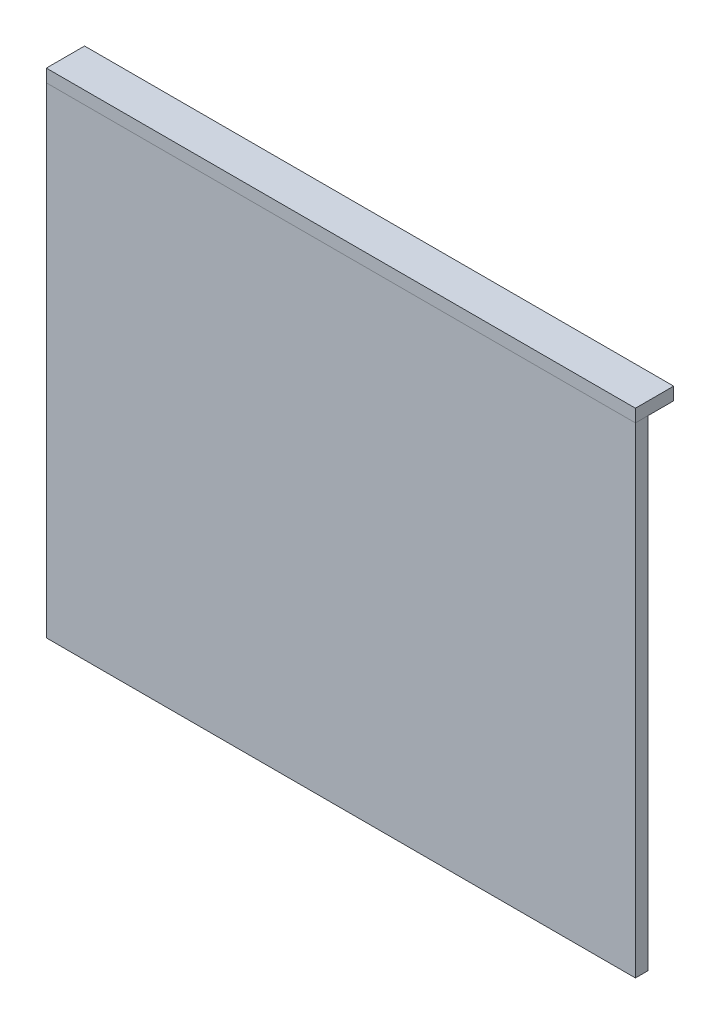
ISO-10303-21;
HEADER;
FILE_DESCRIPTION(('STEP AP214'),'2;1');
FILE_NAME('part.step','',(''),(''),'','','');
FILE_SCHEMA(('AUTOMOTIVE_DESIGN { 1 0 10303 214 1 1 1 1 }'));
ENDSEC;
DATA;
#1=APPLICATION_CONTEXT('core data for automotive mechanical design processes');
#2=APPLICATION_PROTOCOL_DEFINITION('international standard','automotive_design',2000,#1);
#3=PRODUCT_CONTEXT('',#1,'mechanical');
#4=PRODUCT('Part','Part','',(#3));
#5=PRODUCT_RELATED_PRODUCT_CATEGORY('part','',(#4));
#6=PRODUCT_DEFINITION_FORMATION('','',#4);
#7=PRODUCT_DEFINITION_CONTEXT('part definition',#1,'design');
#8=PRODUCT_DEFINITION('design','',#6,#7);
#9=PRODUCT_DEFINITION_SHAPE('','',#8);
#10=(LENGTH_UNIT() NAMED_UNIT(*) SI_UNIT(.MILLI.,.METRE.));
#11=(NAMED_UNIT(*) PLANE_ANGLE_UNIT() SI_UNIT($,.RADIAN.));
#12=(NAMED_UNIT(*) SI_UNIT($,.STERADIAN.) SOLID_ANGLE_UNIT());
#13=UNCERTAINTY_MEASURE_WITH_UNIT(LENGTH_MEASURE(1.E-05),#10,'distance_accuracy_value','');
#14=(GEOMETRIC_REPRESENTATION_CONTEXT(3) GLOBAL_UNCERTAINTY_ASSIGNED_CONTEXT((#13)) GLOBAL_UNIT_ASSIGNED_CONTEXT((#10,
#11,#12)) REPRESENTATION_CONTEXT('',''));
#15=CARTESIAN_POINT('',(0.,0.,0.));
#16=DIRECTION('',(0.,0.,1.));
#17=DIRECTION('',(1.,0.,0.));
#18=AXIS2_PLACEMENT_3D('',#15,#16,#17);
#19=CARTESIAN_POINT('',(1668.64385266952,653.49685628366,0.));
#20=DIRECTION('',(0.,0.,-1.));
#21=DIRECTION('',(-1.,0.,0.));
#22=AXIS2_PLACEMENT_3D('',#19,#20,#21);
#23=PLANE('',#22);
#24=DIRECTION('',(1.,0.,0.));
#25=VECTOR('',#24,1.);
#26=CARTESIAN_POINT('',(1668.64385266952,640.79685628366,0.));
#27=LINE('',#26,#25);
#28=CARTESIAN_POINT('',(1081.90385266952,640.79685628366,0.));
#29=VERTEX_POINT('',#28);
#30=CARTESIAN_POINT('',(1668.64385266952,640.79685628366,0.));
#31=VERTEX_POINT('',#30);
#32=EDGE_CURVE('E106',#29,#31,#27,.T.);
#33=ORIENTED_EDGE('',*,*,#32,.T.);
#34=DIRECTION('',(0.,-1.,0.));
#35=VECTOR('',#34,1.);
#36=CARTESIAN_POINT('',(1668.64385266952,653.49685628366,0.));
#37=LINE('',#36,#35);
#38=CARTESIAN_POINT('',(1668.64385266952,653.49685628366,0.));
#39=VERTEX_POINT('',#38);
#40=EDGE_CURVE('E12',#39,#31,#37,.T.);
#41=ORIENTED_EDGE('',*,*,#40,.F.);
#42=DIRECTION('',(1.,0.,0.));
#43=VECTOR('',#42,1.);
#44=CARTESIAN_POINT('',(1668.64385266952,653.49685628366,0.));
#45=LINE('',#44,#43);
#46=CARTESIAN_POINT('',(1081.90385266952,653.49685628366,0.));
#47=VERTEX_POINT('',#46);
#48=EDGE_CURVE('E94',#47,#39,#45,.T.);
#49=ORIENTED_EDGE('',*,*,#48,.F.);
#50=DIRECTION('',(0.,-1.,0.));
#51=VECTOR('',#50,1.);
#52=CARTESIAN_POINT('',(1081.90385266952,653.49685628366,0.));
#53=LINE('',#52,#51);
#54=EDGE_CURVE('E102',#47,#29,#53,.T.);
#55=ORIENTED_EDGE('',*,*,#54,.T.);
#56=EDGE_LOOP('',(#33,#41,#49,#55));
#57=FACE_BOUND('',#56,.T.);
#58=ADVANCED_FACE('F43',(#57),#23,.F.);
#59=CARTESIAN_POINT('',(1668.64385266952,653.49685628366,-38.1));
#60=DIRECTION('',(-1.,0.,0.));
#61=DIRECTION('',(0.,0.,1.));
#62=AXIS2_PLACEMENT_3D('',#59,#60,#61);
#63=PLANE('',#62);
#64=DIRECTION('',(0.,0.,-1.));
#65=VECTOR('',#64,1.);
#66=CARTESIAN_POINT('',(1668.64385266952,640.79685628366,-38.1));
#67=LINE('',#66,#65);
#68=CARTESIAN_POINT('',(1668.64385266952,640.79685628366,-38.1));
#69=VERTEX_POINT('',#68);
#70=EDGE_CURVE('E98',#31,#69,#67,.T.);
#71=ORIENTED_EDGE('',*,*,#70,.T.);
#72=DIRECTION('',(0.,-1.,0.));
#73=VECTOR('',#72,1.);
#74=CARTESIAN_POINT('',(1668.64385266952,653.49685628366,-38.1));
#75=LINE('',#74,#73);
#76=CARTESIAN_POINT('',(1668.64385266952,653.49685628366,-38.1));
#77=VERTEX_POINT('',#76);
#78=EDGE_CURVE('E51',#77,#69,#75,.T.);
#79=ORIENTED_EDGE('',*,*,#78,.F.);
#80=DIRECTION('',(0.,0.,-1.));
#81=VECTOR('',#80,1.);
#82=CARTESIAN_POINT('',(1668.64385266952,653.49685628366,-38.1));
#83=LINE('',#82,#81);
#84=EDGE_CURVE('E89',#39,#77,#83,.T.);
#85=ORIENTED_EDGE('',*,*,#84,.F.);
#86=ORIENTED_EDGE('',*,*,#40,.T.);
#87=EDGE_LOOP('',(#71,#79,#85,#86));
#88=FACE_BOUND('',#87,.T.);
#89=ADVANCED_FACE('F97',(#88),#63,.F.);
#90=CARTESIAN_POINT('',(1081.90385266952,653.49685628366,-38.1));
#91=DIRECTION('',(0.,0.,1.));
#92=DIRECTION('',(1.,0.,0.));
#93=AXIS2_PLACEMENT_3D('',#90,#91,#92);
#94=PLANE('',#93);
#95=DIRECTION('',(-1.,0.,0.));
#96=VECTOR('',#95,1.);
#97=CARTESIAN_POINT('',(1081.90385266952,640.79685628366,-38.1));
#98=LINE('',#97,#96);
#99=CARTESIAN_POINT('',(1081.90385266952,640.79685628366,-38.1));
#100=VERTEX_POINT('',#99);
#101=EDGE_CURVE('E76',#69,#100,#98,.T.);
#102=ORIENTED_EDGE('',*,*,#101,.T.);
#103=DIRECTION('',(0.,-1.,0.));
#104=VECTOR('',#103,1.);
#105=CARTESIAN_POINT('',(1081.90385266952,653.49685628366,-38.1));
#106=LINE('',#105,#104);
#107=CARTESIAN_POINT('',(1081.90385266952,653.49685628366,-38.1));
#108=VERTEX_POINT('',#107);
#109=EDGE_CURVE('E99',#108,#100,#106,.T.);
#110=ORIENTED_EDGE('',*,*,#109,.F.);
#111=DIRECTION('',(-1.,0.,0.));
#112=VECTOR('',#111,1.);
#113=CARTESIAN_POINT('',(1081.90385266952,653.49685628366,-38.1));
#114=LINE('',#113,#112);
#115=EDGE_CURVE('E92',#77,#108,#114,.T.);
#116=ORIENTED_EDGE('',*,*,#115,.F.);
#117=ORIENTED_EDGE('',*,*,#78,.T.);
#118=EDGE_LOOP('',(#102,#110,#116,#117));
#119=FACE_BOUND('',#118,.T.);
#120=ADVANCED_FACE('F100',(#119),#94,.F.);
#121=CARTESIAN_POINT('',(1081.90385266952,653.49685628366,0.));
#122=DIRECTION('',(1.,0.,0.));
#123=DIRECTION('',(0.,0.,-1.));
#124=AXIS2_PLACEMENT_3D('',#121,#122,#123);
#125=PLANE('',#124);
#126=DIRECTION('',(0.,0.,1.));
#127=VECTOR('',#126,1.);
#128=CARTESIAN_POINT('',(1081.90385266952,640.79685628366,0.));
#129=LINE('',#128,#127);
#130=EDGE_CURVE('E82',#100,#29,#129,.T.);
#131=ORIENTED_EDGE('',*,*,#130,.T.);
#132=ORIENTED_EDGE('',*,*,#54,.F.);
#133=DIRECTION('',(0.,0.,1.));
#134=VECTOR('',#133,1.);
#135=CARTESIAN_POINT('',(1081.90385266952,653.49685628366,0.));
#136=LINE('',#135,#134);
#137=EDGE_CURVE('E59',#108,#47,#136,.T.);
#138=ORIENTED_EDGE('',*,*,#137,.F.);
#139=ORIENTED_EDGE('',*,*,#109,.T.);
#140=EDGE_LOOP('',(#131,#132,#138,#139));
#141=FACE_BOUND('',#140,.T.);
#142=ADVANCED_FACE('F113',(#141),#125,.F.);
#143=CARTESIAN_POINT('',(0.,653.49685628366,0.));
#144=DIRECTION('',(0.,-1.,0.));
#145=DIRECTION('',(0.,0.,-1.));
#146=AXIS2_PLACEMENT_3D('',#143,#144,#145);
#147=PLANE('',#146);
#148=ORIENTED_EDGE('',*,*,#48,.T.);
#149=ORIENTED_EDGE('',*,*,#84,.T.);
#150=ORIENTED_EDGE('',*,*,#115,.T.);
#151=ORIENTED_EDGE('',*,*,#137,.T.);
#152=EDGE_LOOP('',(#148,#149,#150,#151));
#153=FACE_BOUND('',#152,.T.);
#154=ADVANCED_FACE('F90',(#153),#147,.F.);
#155=CARTESIAN_POINT('',(0.,640.79685628366,0.));
#156=DIRECTION('',(0.,-1.,0.));
#157=DIRECTION('',(0.,0.,-1.));
#158=AXIS2_PLACEMENT_3D('',#155,#156,#157);
#159=PLANE('',#158);
#160=ORIENTED_EDGE('',*,*,#32,.F.);
#161=ORIENTED_EDGE('',*,*,#130,.F.);
#162=ORIENTED_EDGE('',*,*,#101,.F.);
#163=ORIENTED_EDGE('',*,*,#70,.F.);
#164=EDGE_LOOP('',(#160,#161,#162,#163));
#165=FACE_BOUND('',#164,.T.);
#166=ADVANCED_FACE('F116',(#165),#159,.T.);
#167=CLOSED_SHELL('',(#58,#89,#120,#142,#154,#166));
#168=MANIFOLD_SOLID_BREP('B2',#167);
#169=CARTESIAN_POINT('',(1081.90385266952,640.79685628366,-12.7));
#170=DIRECTION('',(0.,1.,0.));
#171=DIRECTION('',(0.,0.,1.));
#172=AXIS2_PLACEMENT_3D('',#169,#170,#171);
#173=PLANE('',#172);
#174=DIRECTION('',(-1.,0.,0.));
#175=VECTOR('',#174,1.);
#176=CARTESIAN_POINT('',(1081.90385266952,640.79685628366,0.));
#177=LINE('',#176,#175);
#178=CARTESIAN_POINT('',(1668.64385266952,640.79685628366,0.));
#179=VERTEX_POINT('',#178);
#180=CARTESIAN_POINT('',(1081.90385266952,640.79685628366,0.));
#181=VERTEX_POINT('',#180);
#182=EDGE_CURVE('E231',#179,#181,#177,.T.);
#183=ORIENTED_EDGE('',*,*,#182,.F.);
#184=DIRECTION('',(0.,0.,1.));
#185=VECTOR('',#184,1.);
#186=CARTESIAN_POINT('',(1668.64385266952,640.79685628366,-12.7));
#187=LINE('',#186,#185);
#188=CARTESIAN_POINT('',(1668.64385266952,640.79685628366,-12.7));
#189=VERTEX_POINT('',#188);
#190=EDGE_CURVE('E41',#189,#179,#187,.T.);
#191=ORIENTED_EDGE('',*,*,#190,.F.);
#192=DIRECTION('',(-1.,0.,0.));
#193=VECTOR('',#192,1.);
#194=CARTESIAN_POINT('',(1081.90385266952,640.79685628366,-12.7));
#195=LINE('',#194,#193);
#196=CARTESIAN_POINT('',(1081.90385266952,640.79685628366,-12.7));
#197=VERTEX_POINT('',#196);
#198=EDGE_CURVE('E225',#189,#197,#195,.T.);
#199=ORIENTED_EDGE('',*,*,#198,.T.);
#200=DIRECTION('',(0.,0.,1.));
#201=VECTOR('',#200,1.);
#202=CARTESIAN_POINT('',(1081.90385266952,640.79685628366,-12.7));
#203=LINE('',#202,#201);
#204=EDGE_CURVE('E170',#197,#181,#203,.T.);
#205=ORIENTED_EDGE('',*,*,#204,.T.);
#206=EDGE_LOOP('',(#183,#191,#199,#205));
#207=FACE_BOUND('',#206,.T.);
#208=ADVANCED_FACE('F167',(#207),#173,.T.);
#209=CARTESIAN_POINT('',(1668.64385266952,162.00685628366,-12.7));
#210=DIRECTION('',(1.,0.,0.));
#211=DIRECTION('',(0.,0.,-1.));
#212=AXIS2_PLACEMENT_3D('',#209,#210,#211);
#213=PLANE('',#212);
#214=DIRECTION('',(0.,1.,0.));
#215=VECTOR('',#214,1.);
#216=CARTESIAN_POINT('',(1668.64385266952,162.00685628366,0.));
#217=LINE('',#216,#215);
#218=CARTESIAN_POINT('',(1668.64385266952,162.00685628366,0.));
#219=VERTEX_POINT('',#218);
#220=EDGE_CURVE('E227',#219,#179,#217,.T.);
#221=ORIENTED_EDGE('',*,*,#220,.F.);
#222=DIRECTION('',(0.,0.,1.));
#223=VECTOR('',#222,1.);
#224=CARTESIAN_POINT('',(1668.64385266952,162.00685628366,-12.7));
#225=LINE('',#224,#223);
#226=CARTESIAN_POINT('',(1668.64385266952,162.00685628366,-12.7));
#227=VERTEX_POINT('',#226);
#228=EDGE_CURVE('E176',#227,#219,#225,.T.);
#229=ORIENTED_EDGE('',*,*,#228,.F.);
#230=DIRECTION('',(0.,1.,0.));
#231=VECTOR('',#230,1.);
#232=CARTESIAN_POINT('',(1668.64385266952,162.00685628366,-12.7));
#233=LINE('',#232,#231);
#234=EDGE_CURVE('E222',#227,#189,#233,.T.);
#235=ORIENTED_EDGE('',*,*,#234,.T.);
#236=ORIENTED_EDGE('',*,*,#190,.T.);
#237=EDGE_LOOP('',(#221,#229,#235,#236));
#238=FACE_BOUND('',#237,.T.);
#239=ADVANCED_FACE('F241',(#238),#213,.T.);
#240=CARTESIAN_POINT('',(1081.90385266952,162.00685628366,-12.7));
#241=DIRECTION('',(0.,-1.,0.));
#242=DIRECTION('',(0.,0.,-1.));
#243=AXIS2_PLACEMENT_3D('',#240,#241,#242);
#244=PLANE('',#243);
#245=DIRECTION('',(1.,0.,0.));
#246=VECTOR('',#245,1.);
#247=CARTESIAN_POINT('',(1081.90385266952,162.00685628366,0.));
#248=LINE('',#247,#246);
#249=CARTESIAN_POINT('',(1081.90385266952,162.00685628366,0.));
#250=VERTEX_POINT('',#249);
#251=EDGE_CURVE('E217',#250,#219,#248,.T.);
#252=ORIENTED_EDGE('',*,*,#251,.F.);
#253=DIRECTION('',(0.,0.,1.));
#254=VECTOR('',#253,1.);
#255=CARTESIAN_POINT('',(1081.90385266952,162.00685628366,-12.7));
#256=LINE('',#255,#254);
#257=CARTESIAN_POINT('',(1081.90385266952,162.00685628366,-12.7));
#258=VERTEX_POINT('',#257);
#259=EDGE_CURVE('E212',#258,#250,#256,.T.);
#260=ORIENTED_EDGE('',*,*,#259,.F.);
#261=DIRECTION('',(1.,0.,0.));
#262=VECTOR('',#261,1.);
#263=CARTESIAN_POINT('',(1081.90385266952,162.00685628366,-12.7));
#264=LINE('',#263,#262);
#265=EDGE_CURVE('E215',#258,#227,#264,.T.);
#266=ORIENTED_EDGE('',*,*,#265,.T.);
#267=ORIENTED_EDGE('',*,*,#228,.T.);
#268=EDGE_LOOP('',(#252,#260,#266,#267));
#269=FACE_BOUND('',#268,.T.);
#270=ADVANCED_FACE('F214',(#269),#244,.T.);
#271=CARTESIAN_POINT('',(1081.90385266952,640.79685628366,-12.7));
#272=DIRECTION('',(-1.,0.,0.));
#273=DIRECTION('',(0.,0.,1.));
#274=AXIS2_PLACEMENT_3D('',#271,#272,#273);
#275=PLANE('',#274);
#276=DIRECTION('',(0.,-1.,0.));
#277=VECTOR('',#276,1.);
#278=CARTESIAN_POINT('',(1081.90385266952,640.79685628366,0.));
#279=LINE('',#278,#277);
#280=EDGE_CURVE('E234',#181,#250,#279,.T.);
#281=ORIENTED_EDGE('',*,*,#280,.F.);
#282=ORIENTED_EDGE('',*,*,#204,.F.);
#283=DIRECTION('',(0.,-1.,0.));
#284=VECTOR('',#283,1.);
#285=CARTESIAN_POINT('',(1081.90385266952,640.79685628366,-12.7));
#286=LINE('',#285,#284);
#287=EDGE_CURVE('E221',#197,#258,#286,.T.);
#288=ORIENTED_EDGE('',*,*,#287,.T.);
#289=ORIENTED_EDGE('',*,*,#259,.T.);
#290=EDGE_LOOP('',(#281,#282,#288,#289));
#291=FACE_BOUND('',#290,.T.);
#292=ADVANCED_FACE('F224',(#291),#275,.T.);
#293=CARTESIAN_POINT('',(0.,0.,-12.7));
#294=DIRECTION('',(0.,0.,1.));
#295=DIRECTION('',(1.,0.,0.));
#296=AXIS2_PLACEMENT_3D('',#293,#294,#295);
#297=PLANE('',#296);
#298=ORIENTED_EDGE('',*,*,#198,.F.);
#299=ORIENTED_EDGE('',*,*,#234,.F.);
#300=ORIENTED_EDGE('',*,*,#265,.F.);
#301=ORIENTED_EDGE('',*,*,#287,.F.);
#302=EDGE_LOOP('',(#298,#299,#300,#301));
#303=FACE_BOUND('',#302,.T.);
#304=ADVANCED_FACE('F220',(#303),#297,.F.);
#305=CARTESIAN_POINT('',(0.,0.,0.));
#306=DIRECTION('',(0.,0.,1.));
#307=DIRECTION('',(1.,0.,0.));
#308=AXIS2_PLACEMENT_3D('',#305,#306,#307);
#309=PLANE('',#308);
#310=ORIENTED_EDGE('',*,*,#182,.T.);
#311=ORIENTED_EDGE('',*,*,#280,.T.);
#312=ORIENTED_EDGE('',*,*,#251,.T.);
#313=ORIENTED_EDGE('',*,*,#220,.T.);
#314=EDGE_LOOP('',(#310,#311,#312,#313));
#315=FACE_BOUND('',#314,.T.);
#316=ADVANCED_FACE('F240',(#315),#309,.T.);
#317=CLOSED_SHELL('',(#208,#239,#270,#292,#304,#316));
#318=MANIFOLD_SOLID_BREP('B6',#317);
#319=ADVANCED_BREP_SHAPE_REPRESENTATION('',(#18,#168,#318),#14);
#320=SHAPE_DEFINITION_REPRESENTATION(#9,#319);
ENDSEC;
END-ISO-10303-21;
